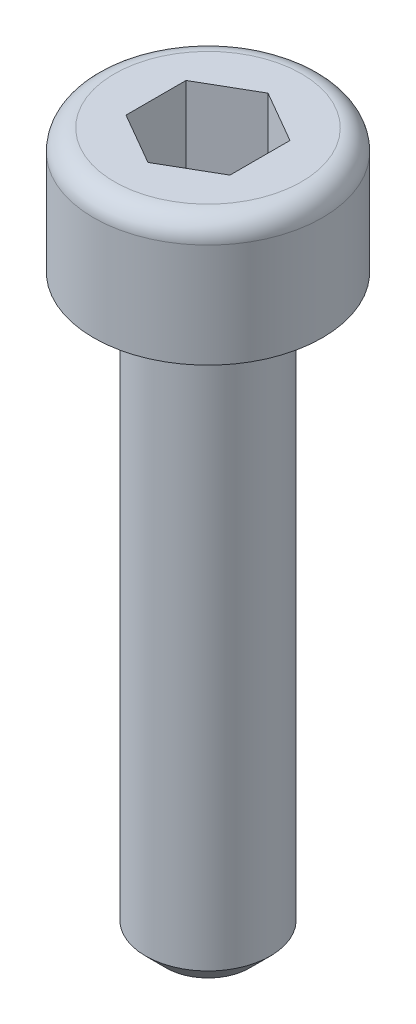
ISO-10303-21;
HEADER;
FILE_DESCRIPTION(('STEP AP214'),'2;1');
FILE_NAME('part.step','',(''),(''),'','','');
FILE_SCHEMA(('AUTOMOTIVE_DESIGN { 1 0 10303 214 1 1 1 1 }'));
ENDSEC;
DATA;
#1=APPLICATION_CONTEXT('core data for automotive mechanical design processes');
#2=APPLICATION_PROTOCOL_DEFINITION('international standard','automotive_design',2000,#1);
#3=PRODUCT_CONTEXT('',#1,'mechanical');
#4=PRODUCT('Part','Part','',(#3));
#5=PRODUCT_RELATED_PRODUCT_CATEGORY('part','',(#4));
#6=PRODUCT_DEFINITION_FORMATION('','',#4);
#7=PRODUCT_DEFINITION_CONTEXT('part definition',#1,'design');
#8=PRODUCT_DEFINITION('design','',#6,#7);
#9=PRODUCT_DEFINITION_SHAPE('','',#8);
#10=(LENGTH_UNIT() NAMED_UNIT(*) SI_UNIT(.MILLI.,.METRE.));
#11=(NAMED_UNIT(*) PLANE_ANGLE_UNIT() SI_UNIT($,.RADIAN.));
#12=(NAMED_UNIT(*) SI_UNIT($,.STERADIAN.) SOLID_ANGLE_UNIT());
#13=UNCERTAINTY_MEASURE_WITH_UNIT(LENGTH_MEASURE(1.E-05),#10,'distance_accuracy_value','');
#14=(GEOMETRIC_REPRESENTATION_CONTEXT(3) GLOBAL_UNCERTAINTY_ASSIGNED_CONTEXT((#13)) GLOBAL_UNIT_ASSIGNED_CONTEXT((#10,
#11,#12)) REPRESENTATION_CONTEXT('',''));
#15=CARTESIAN_POINT('',(0.,0.,0.));
#16=DIRECTION('',(0.,0.,1.));
#17=DIRECTION('',(1.,0.,0.));
#18=AXIS2_PLACEMENT_3D('',#15,#16,#17);
#19=CARTESIAN_POINT('',(0.,0.,0.));
#20=DIRECTION('',(0.,-1.,0.));
#21=DIRECTION('',(0.,0.,-1.));
#22=AXIS2_PLACEMENT_3D('',#19,#20,#21);
#23=PLANE('',#22);
#24=CARTESIAN_POINT('',(0.,0.,0.));
#25=DIRECTION('',(0.,-1.,0.));
#26=DIRECTION('',(0.,0.,-1.));
#27=AXIS2_PLACEMENT_3D('',#24,#25,#26);
#28=CIRCLE('',#27,2.25);
#29=CARTESIAN_POINT('',(0.,0.,-2.25));
#30=VERTEX_POINT('',#29);
#31=EDGE_CURVE('E42',#30,#30,#28,.F.);
#32=ORIENTED_EDGE('',*,*,#31,.T.);
#33=EDGE_LOOP('',(#32));
#34=FACE_BOUND('',#33,.T.);
#35=DIRECTION('',(-0.866025403784439,0.,-0.5));
#36=VECTOR('',#35,1.);
#37=CARTESIAN_POINT('',(1.25,0.,-0.721687836487032));
#38=LINE('',#37,#36);
#39=CARTESIAN_POINT('',(1.25,0.,-0.721687836487032));
#40=VERTEX_POINT('',#39);
#41=CARTESIAN_POINT('',(0.,0.,-1.44337567297406));
#42=VERTEX_POINT('',#41);
#43=EDGE_CURVE('E123',#40,#42,#38,.T.);
#44=ORIENTED_EDGE('',*,*,#43,.F.);
#45=DIRECTION('',(0.,0.,-1.));
#46=VECTOR('',#45,1.);
#47=CARTESIAN_POINT('',(1.25,0.,0.721687836487033));
#48=LINE('',#47,#46);
#49=CARTESIAN_POINT('',(1.25,0.,0.721687836487033));
#50=VERTEX_POINT('',#49);
#51=EDGE_CURVE('E49',#50,#40,#48,.T.);
#52=ORIENTED_EDGE('',*,*,#51,.F.);
#53=DIRECTION('',(0.866025403784439,0.,-0.5));
#54=VECTOR('',#53,1.);
#55=CARTESIAN_POINT('',(0.,0.,1.44337567297406));
#56=LINE('',#55,#54);
#57=CARTESIAN_POINT('',(0.,0.,1.44337567297406));
#58=VERTEX_POINT('',#57);
#59=EDGE_CURVE('E132',#58,#50,#56,.T.);
#60=ORIENTED_EDGE('',*,*,#59,.F.);
#61=DIRECTION('',(0.866025403784439,0.,0.5));
#62=VECTOR('',#61,1.);
#63=CARTESIAN_POINT('',(-1.25,0.,0.721687836487031));
#64=LINE('',#63,#62);
#65=CARTESIAN_POINT('',(-1.25,0.,0.721687836487031));
#66=VERTEX_POINT('',#65);
#67=EDGE_CURVE('E130',#66,#58,#64,.T.);
#68=ORIENTED_EDGE('',*,*,#67,.F.);
#69=DIRECTION('',(0.,0.,1.));
#70=VECTOR('',#69,1.);
#71=CARTESIAN_POINT('',(-1.25,0.,-0.721687836487033));
#72=LINE('',#71,#70);
#73=CARTESIAN_POINT('',(-1.25,0.,-0.721687836487033));
#74=VERTEX_POINT('',#73);
#75=EDGE_CURVE('E97',#74,#66,#72,.T.);
#76=ORIENTED_EDGE('',*,*,#75,.F.);
#77=DIRECTION('',(-0.866025403784439,0.,0.5));
#78=VECTOR('',#77,1.);
#79=CARTESIAN_POINT('',(0.,0.,-1.44337567297406));
#80=LINE('',#79,#78);
#81=EDGE_CURVE('E126',#42,#74,#80,.T.);
#82=ORIENTED_EDGE('',*,*,#81,.F.);
#83=EDGE_LOOP('',(#44,#52,#60,#68,#76,#82));
#84=FACE_BOUND('',#83,.T.);
#85=ADVANCED_FACE('F34',(#34,#84),#23,.F.);
#86=CARTESIAN_POINT('',(0.,0.,0.));
#87=DIRECTION('',(0.,1.,0.));
#88=DIRECTION('',(0.,0.,1.));
#89=AXIS2_PLACEMENT_3D('',#86,#87,#88);
#90=CYLINDRICAL_SURFACE('',#89,2.75);
#91=CARTESIAN_POINT('',(0.,-0.5,0.));
#92=DIRECTION('',(0.,-1.,0.));
#93=DIRECTION('',(0.,0.,-1.));
#94=AXIS2_PLACEMENT_3D('',#91,#92,#93);
#95=CIRCLE('',#94,2.75);
#96=CARTESIAN_POINT('',(0.,-0.5,-2.75));
#97=VERTEX_POINT('',#96);
#98=EDGE_CURVE('E11',#97,#97,#95,.T.);
#99=ORIENTED_EDGE('',*,*,#98,.T.);
#100=EDGE_LOOP('',(#99));
#101=FACE_BOUND('',#100,.T.);
#102=CARTESIAN_POINT('',(0.,-3.,0.));
#103=DIRECTION('',(0.,1.,0.));
#104=DIRECTION('',(0.,0.,1.));
#105=AXIS2_PLACEMENT_3D('',#102,#103,#104);
#106=CIRCLE('',#105,2.75);
#107=CARTESIAN_POINT('',(0.,-3.,2.75));
#108=VERTEX_POINT('',#107);
#109=EDGE_CURVE('E144',#108,#108,#106,.T.);
#110=ORIENTED_EDGE('',*,*,#109,.T.);
#111=EDGE_LOOP('',(#110));
#112=FACE_BOUND('',#111,.T.);
#113=ADVANCED_FACE('F166',(#101,#112),#90,.T.);
#114=CARTESIAN_POINT('',(2.75,-3.,0.));
#115=DIRECTION('',(0.,1.,0.));
#116=DIRECTION('',(0.,0.,1.));
#117=AXIS2_PLACEMENT_3D('',#114,#115,#116);
#118=PLANE('',#117);
#119=ORIENTED_EDGE('',*,*,#109,.F.);
#120=EDGE_LOOP('',(#119));
#121=FACE_BOUND('',#120,.T.);
#122=CARTESIAN_POINT('',(0.,-3.,0.));
#123=DIRECTION('',(0.,1.,0.));
#124=DIRECTION('',(0.,0.,1.));
#125=AXIS2_PLACEMENT_3D('',#122,#123,#124);
#126=CIRCLE('',#125,1.5);
#127=CARTESIAN_POINT('',(0.,-3.,1.5));
#128=VERTEX_POINT('',#127);
#129=EDGE_CURVE('E136',#128,#128,#126,.T.);
#130=ORIENTED_EDGE('',*,*,#129,.T.);
#131=EDGE_LOOP('',(#130));
#132=FACE_BOUND('',#131,.T.);
#133=ADVANCED_FACE('F171',(#121,#132),#118,.F.);
#134=CARTESIAN_POINT('',(0.,0.,0.));
#135=DIRECTION('',(0.,1.,0.));
#136=DIRECTION('',(0.,0.,1.));
#137=AXIS2_PLACEMENT_3D('',#134,#135,#136);
#138=CYLINDRICAL_SURFACE('',#137,1.5);
#139=CARTESIAN_POINT('',(0.,-16.5,0.));
#140=DIRECTION('',(0.,1.,0.));
#141=DIRECTION('',(0.,0.,1.));
#142=AXIS2_PLACEMENT_3D('',#139,#140,#141);
#143=CIRCLE('',#142,1.5);
#144=CARTESIAN_POINT('',(0.,-16.5,1.5));
#145=VERTEX_POINT('',#144);
#146=EDGE_CURVE('E147',#145,#145,#143,.T.);
#147=ORIENTED_EDGE('',*,*,#146,.T.);
#148=EDGE_LOOP('',(#147));
#149=FACE_BOUND('',#148,.T.);
#150=ORIENTED_EDGE('',*,*,#129,.F.);
#151=EDGE_LOOP('',(#150));
#152=FACE_BOUND('',#151,.T.);
#153=ADVANCED_FACE('F177',(#149,#152),#138,.T.);
#154=CARTESIAN_POINT('',(1.5,-17.,0.));
#155=DIRECTION('',(0.,1.,0.));
#156=DIRECTION('',(0.,0.,1.));
#157=AXIS2_PLACEMENT_3D('',#154,#155,#156);
#158=PLANE('',#157);
#159=CARTESIAN_POINT('',(0.,-17.,0.));
#160=DIRECTION('',(0.,1.,0.));
#161=DIRECTION('',(0.,0.,1.));
#162=AXIS2_PLACEMENT_3D('',#159,#160,#161);
#163=CIRCLE('',#162,0.999999999999996);
#164=CARTESIAN_POINT('',(0.,-17.,0.999999999999996));
#165=VERTEX_POINT('',#164);
#166=EDGE_CURVE('E150',#165,#165,#163,.F.);
#167=ORIENTED_EDGE('',*,*,#166,.T.);
#168=EDGE_LOOP('',(#167));
#169=FACE_BOUND('',#168,.T.);
#170=ADVANCED_FACE('F181',(#169),#158,.F.);
#171=CARTESIAN_POINT('',(1.25,-2.,0.721687836487033));
#172=DIRECTION('',(1.,0.,0.));
#173=DIRECTION('',(0.,0.,-1.));
#174=AXIS2_PLACEMENT_3D('',#171,#172,#173);
#175=PLANE('',#174);
#176=ORIENTED_EDGE('',*,*,#51,.T.);
#177=DIRECTION('',(0.,1.,0.));
#178=VECTOR('',#177,1.);
#179=CARTESIAN_POINT('',(1.25,-2.,-0.721687836487032));
#180=LINE('',#179,#178);
#181=CARTESIAN_POINT('',(1.25,-2.,-0.721687836487032));
#182=VERTEX_POINT('',#181);
#183=EDGE_CURVE('E79',#182,#40,#180,.T.);
#184=ORIENTED_EDGE('',*,*,#183,.F.);
#185=DIRECTION('',(0.,0.,-1.));
#186=VECTOR('',#185,1.);
#187=CARTESIAN_POINT('',(1.25,-2.,0.721687836487033));
#188=LINE('',#187,#186);
#189=CARTESIAN_POINT('',(1.25,-2.,0.721687836487033));
#190=VERTEX_POINT('',#189);
#191=EDGE_CURVE('E134',#190,#182,#188,.T.);
#192=ORIENTED_EDGE('',*,*,#191,.F.);
#193=DIRECTION('',(0.,1.,0.));
#194=VECTOR('',#193,1.);
#195=CARTESIAN_POINT('',(1.25,-2.,0.721687836487033));
#196=LINE('',#195,#194);
#197=EDGE_CURVE('E57',#190,#50,#196,.T.);
#198=ORIENTED_EDGE('',*,*,#197,.T.);
#199=EDGE_LOOP('',(#176,#184,#192,#198));
#200=FACE_BOUND('',#199,.T.);
#201=ADVANCED_FACE('F185',(#200),#175,.F.);
#202=CARTESIAN_POINT('',(0.,-2.,1.44337567297406));
#203=DIRECTION('',(0.5,0.,0.866025403784439));
#204=DIRECTION('',(0.866025403784439,0.,-0.5));
#205=AXIS2_PLACEMENT_3D('',#202,#203,#204);
#206=PLANE('',#205);
#207=ORIENTED_EDGE('',*,*,#59,.T.);
#208=ORIENTED_EDGE('',*,*,#197,.F.);
#209=DIRECTION('',(0.866025403784439,0.,-0.5));
#210=VECTOR('',#209,1.);
#211=CARTESIAN_POINT('',(0.,-2.,1.44337567297406));
#212=LINE('',#211,#210);
#213=CARTESIAN_POINT('',(0.,-2.,1.44337567297406));
#214=VERTEX_POINT('',#213);
#215=EDGE_CURVE('E109',#214,#190,#212,.T.);
#216=ORIENTED_EDGE('',*,*,#215,.F.);
#217=DIRECTION('',(0.,1.,0.));
#218=VECTOR('',#217,1.);
#219=CARTESIAN_POINT('',(0.,-2.,1.44337567297406));
#220=LINE('',#219,#218);
#221=EDGE_CURVE('E101',#214,#58,#220,.T.);
#222=ORIENTED_EDGE('',*,*,#221,.T.);
#223=EDGE_LOOP('',(#207,#208,#216,#222));
#224=FACE_BOUND('',#223,.T.);
#225=ADVANCED_FACE('F189',(#224),#206,.F.);
#226=CARTESIAN_POINT('',(-1.25,-2.,0.721687836487031));
#227=DIRECTION('',(-0.5,0.,0.866025403784439));
#228=DIRECTION('',(0.866025403784439,0.,0.5));
#229=AXIS2_PLACEMENT_3D('',#226,#227,#228);
#230=PLANE('',#229);
#231=ORIENTED_EDGE('',*,*,#67,.T.);
#232=ORIENTED_EDGE('',*,*,#221,.F.);
#233=DIRECTION('',(0.866025403784439,0.,0.5));
#234=VECTOR('',#233,1.);
#235=CARTESIAN_POINT('',(-1.25,-2.,0.721687836487031));
#236=LINE('',#235,#234);
#237=CARTESIAN_POINT('',(-1.25,-2.,0.721687836487031));
#238=VERTEX_POINT('',#237);
#239=EDGE_CURVE('E105',#238,#214,#236,.T.);
#240=ORIENTED_EDGE('',*,*,#239,.F.);
#241=DIRECTION('',(0.,1.,0.));
#242=VECTOR('',#241,1.);
#243=CARTESIAN_POINT('',(-1.25,-2.,0.721687836487031));
#244=LINE('',#243,#242);
#245=EDGE_CURVE('E90',#238,#66,#244,.T.);
#246=ORIENTED_EDGE('',*,*,#245,.T.);
#247=EDGE_LOOP('',(#231,#232,#240,#246));
#248=FACE_BOUND('',#247,.T.);
#249=ADVANCED_FACE('F106',(#248),#230,.F.);
#250=CARTESIAN_POINT('',(-1.25,-2.,-0.721687836487033));
#251=DIRECTION('',(-1.,0.,0.));
#252=DIRECTION('',(0.,0.,1.));
#253=AXIS2_PLACEMENT_3D('',#250,#251,#252);
#254=PLANE('',#253);
#255=ORIENTED_EDGE('',*,*,#75,.T.);
#256=ORIENTED_EDGE('',*,*,#245,.F.);
#257=DIRECTION('',(0.,0.,1.));
#258=VECTOR('',#257,1.);
#259=CARTESIAN_POINT('',(-1.25,-2.,-0.721687836487033));
#260=LINE('',#259,#258);
#261=CARTESIAN_POINT('',(-1.25,-2.,-0.721687836487033));
#262=VERTEX_POINT('',#261);
#263=EDGE_CURVE('E94',#262,#238,#260,.T.);
#264=ORIENTED_EDGE('',*,*,#263,.F.);
#265=DIRECTION('',(0.,1.,0.));
#266=VECTOR('',#265,1.);
#267=CARTESIAN_POINT('',(-1.25,-2.,-0.721687836487033));
#268=LINE('',#267,#266);
#269=EDGE_CURVE('E102',#262,#74,#268,.T.);
#270=ORIENTED_EDGE('',*,*,#269,.T.);
#271=EDGE_LOOP('',(#255,#256,#264,#270));
#272=FACE_BOUND('',#271,.T.);
#273=ADVANCED_FACE('F92',(#272),#254,.F.);
#274=CARTESIAN_POINT('',(0.,-2.,-1.44337567297406));
#275=DIRECTION('',(-0.5,0.,-0.866025403784439));
#276=DIRECTION('',(-0.866025403784439,0.,0.5));
#277=AXIS2_PLACEMENT_3D('',#274,#275,#276);
#278=PLANE('',#277);
#279=ORIENTED_EDGE('',*,*,#81,.T.);
#280=ORIENTED_EDGE('',*,*,#269,.F.);
#281=DIRECTION('',(-0.866025403784439,0.,0.5));
#282=VECTOR('',#281,1.);
#283=CARTESIAN_POINT('',(0.,-2.,-1.44337567297406));
#284=LINE('',#283,#282);
#285=CARTESIAN_POINT('',(0.,-2.,-1.44337567297406));
#286=VERTEX_POINT('',#285);
#287=EDGE_CURVE('E115',#286,#262,#284,.T.);
#288=ORIENTED_EDGE('',*,*,#287,.F.);
#289=DIRECTION('',(0.,1.,0.));
#290=VECTOR('',#289,1.);
#291=CARTESIAN_POINT('',(0.,-2.,-1.44337567297406));
#292=LINE('',#291,#290);
#293=EDGE_CURVE('E139',#286,#42,#292,.T.);
#294=ORIENTED_EDGE('',*,*,#293,.T.);
#295=EDGE_LOOP('',(#279,#280,#288,#294));
#296=FACE_BOUND('',#295,.T.);
#297=ADVANCED_FACE('F193',(#296),#278,.F.);
#298=CARTESIAN_POINT('',(1.25,-2.,-0.721687836487032));
#299=DIRECTION('',(0.5,0.,-0.866025403784439));
#300=DIRECTION('',(-0.866025403784439,0.,-0.5));
#301=AXIS2_PLACEMENT_3D('',#298,#299,#300);
#302=PLANE('',#301);
#303=ORIENTED_EDGE('',*,*,#43,.T.);
#304=ORIENTED_EDGE('',*,*,#293,.F.);
#305=DIRECTION('',(-0.866025403784439,0.,-0.5));
#306=VECTOR('',#305,1.);
#307=CARTESIAN_POINT('',(1.25,-2.,-0.721687836487032));
#308=LINE('',#307,#306);
#309=EDGE_CURVE('E117',#182,#286,#308,.T.);
#310=ORIENTED_EDGE('',*,*,#309,.F.);
#311=ORIENTED_EDGE('',*,*,#183,.T.);
#312=EDGE_LOOP('',(#303,#304,#310,#311));
#313=FACE_BOUND('',#312,.T.);
#314=ADVANCED_FACE('F190',(#313),#302,.F.);
#315=CARTESIAN_POINT('',(1.25,-2.,-0.721687836487032));
#316=DIRECTION('',(0.,1.,0.));
#317=DIRECTION('',(0.,0.,1.));
#318=AXIS2_PLACEMENT_3D('',#315,#316,#317);
#319=PLANE('',#318);
#320=ORIENTED_EDGE('',*,*,#191,.T.);
#321=ORIENTED_EDGE('',*,*,#309,.T.);
#322=ORIENTED_EDGE('',*,*,#287,.T.);
#323=ORIENTED_EDGE('',*,*,#263,.T.);
#324=ORIENTED_EDGE('',*,*,#239,.T.);
#325=ORIENTED_EDGE('',*,*,#215,.T.);
#326=EDGE_LOOP('',(#320,#321,#322,#323,#324,#325));
#327=FACE_BOUND('',#326,.T.);
#328=ADVANCED_FACE('F112',(#327),#319,.T.);
#329=CARTESIAN_POINT('',(0.,-16.5,0.));
#330=DIRECTION('',(0.,1.,0.));
#331=DIRECTION('',(0.,0.,1.));
#332=AXIS2_PLACEMENT_3D('',#329,#330,#331);
#333=CONICAL_SURFACE('',#332,1.5,0.785398163397454);
#334=ORIENTED_EDGE('',*,*,#166,.F.);
#335=EDGE_LOOP('',(#334));
#336=FACE_BOUND('',#335,.T.);
#337=ORIENTED_EDGE('',*,*,#146,.F.);
#338=EDGE_LOOP('',(#337));
#339=FACE_BOUND('',#338,.T.);
#340=ADVANCED_FACE('F158',(#336,#339),#333,.T.);
#341=CARTESIAN_POINT('',(0.,-0.5,0.));
#342=DIRECTION('',(0.,-1.,0.));
#343=DIRECTION('',(0.,0.,-1.));
#344=AXIS2_PLACEMENT_3D('',#341,#342,#343);
#345=TOROIDAL_SURFACE('',#344,2.25,0.5);
#346=ORIENTED_EDGE('',*,*,#98,.F.);
#347=EDGE_LOOP('',(#346));
#348=FACE_BOUND('',#347,.T.);
#349=ORIENTED_EDGE('',*,*,#31,.F.);
#350=EDGE_LOOP('',(#349));
#351=FACE_BOUND('',#350,.T.);
#352=ADVANCED_FACE('F36',(#348,#351),#345,.T.);
#353=CLOSED_SHELL('',(#85,#113,#133,#153,#170,#201,#225,#249,#273,#297,#314,#328,#340,#352));
#354=MANIFOLD_SOLID_BREP('B2',#353);
#355=ADVANCED_BREP_SHAPE_REPRESENTATION('',(#18,#354),#14);
#356=SHAPE_DEFINITION_REPRESENTATION(#9,#355);
ENDSEC;
END-ISO-10303-21;
